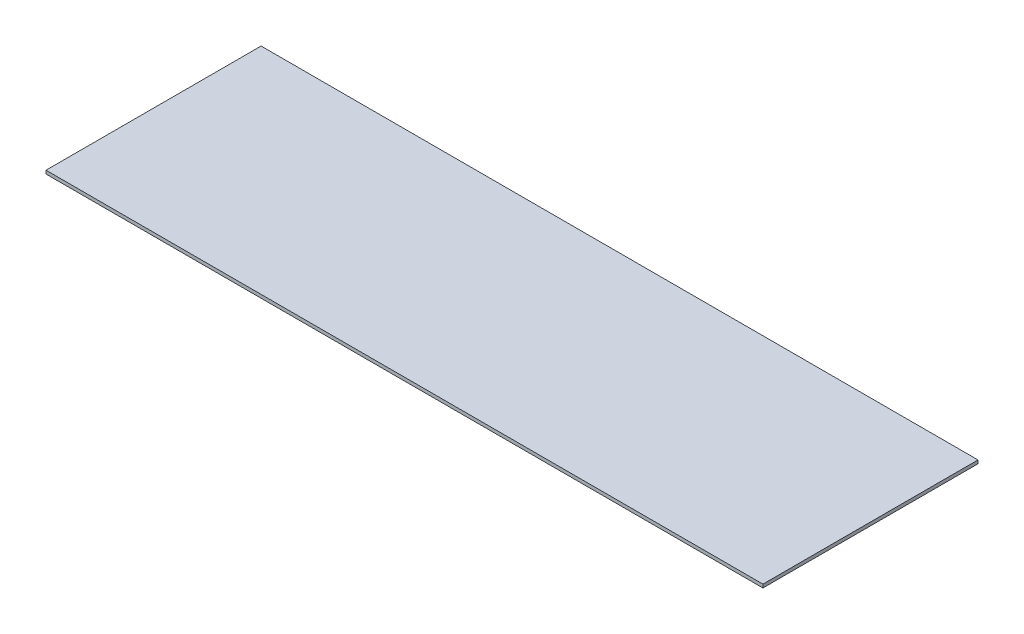
ISO-10303-21;
HEADER;
FILE_DESCRIPTION(('STEP AP214'),'2;1');
FILE_NAME('part.step','',(''),(''),'','','');
FILE_SCHEMA(('AUTOMOTIVE_DESIGN { 1 0 10303 214 1 1 1 1 }'));
ENDSEC;
DATA;
#1=APPLICATION_CONTEXT('core data for automotive mechanical design processes');
#2=APPLICATION_PROTOCOL_DEFINITION('international standard','automotive_design',2000,#1);
#3=PRODUCT_CONTEXT('',#1,'mechanical');
#4=PRODUCT('Part','Part','',(#3));
#5=PRODUCT_RELATED_PRODUCT_CATEGORY('part','',(#4));
#6=PRODUCT_DEFINITION_FORMATION('','',#4);
#7=PRODUCT_DEFINITION_CONTEXT('part definition',#1,'design');
#8=PRODUCT_DEFINITION('design','',#6,#7);
#9=PRODUCT_DEFINITION_SHAPE('','',#8);
#10=(LENGTH_UNIT() NAMED_UNIT(*) SI_UNIT(.MILLI.,.METRE.));
#11=(NAMED_UNIT(*) PLANE_ANGLE_UNIT() SI_UNIT($,.RADIAN.));
#12=(NAMED_UNIT(*) SI_UNIT($,.STERADIAN.) SOLID_ANGLE_UNIT());
#13=UNCERTAINTY_MEASURE_WITH_UNIT(LENGTH_MEASURE(1.E-05),#10,'distance_accuracy_value','');
#14=(GEOMETRIC_REPRESENTATION_CONTEXT(3) GLOBAL_UNCERTAINTY_ASSIGNED_CONTEXT((#13)) GLOBAL_UNIT_ASSIGNED_CONTEXT((#10,
#11,#12)) REPRESENTATION_CONTEXT('',''));
#15=CARTESIAN_POINT('',(0.,0.,0.));
#16=DIRECTION('',(0.,0.,1.));
#17=DIRECTION('',(1.,0.,0.));
#18=AXIS2_PLACEMENT_3D('',#15,#16,#17);
#19=CARTESIAN_POINT('',(0.,4.7625,0.));
#20=DIRECTION('',(1.,0.,0.));
#21=DIRECTION('',(0.,0.,-1.));
#22=AXIS2_PLACEMENT_3D('',#19,#20,#21);
#23=PLANE('',#22);
#24=DIRECTION('',(0.,0.,1.));
#25=VECTOR('',#24,1.);
#26=CARTESIAN_POINT('',(0.,0.,0.));
#27=LINE('',#26,#25);
#28=CARTESIAN_POINT('',(0.,0.,-304.8));
#29=VERTEX_POINT('',#28);
#30=CARTESIAN_POINT('',(0.,0.,0.));
#31=VERTEX_POINT('',#30);
#32=EDGE_CURVE('E97',#29,#31,#27,.T.);
#33=ORIENTED_EDGE('',*,*,#32,.T.);
#34=DIRECTION('',(0.,-1.,0.));
#35=VECTOR('',#34,1.);
#36=CARTESIAN_POINT('',(0.,4.7625,0.));
#37=LINE('',#36,#35);
#38=CARTESIAN_POINT('',(0.,4.7625,0.));
#39=VERTEX_POINT('',#38);
#40=EDGE_CURVE('E11',#39,#31,#37,.T.);
#41=ORIENTED_EDGE('',*,*,#40,.F.);
#42=DIRECTION('',(0.,0.,1.));
#43=VECTOR('',#42,1.);
#44=CARTESIAN_POINT('',(0.,4.7625,0.));
#45=LINE('',#44,#43);
#46=CARTESIAN_POINT('',(0.,4.7625,-304.8));
#47=VERTEX_POINT('',#46);
#48=EDGE_CURVE('E85',#47,#39,#45,.T.);
#49=ORIENTED_EDGE('',*,*,#48,.F.);
#50=DIRECTION('',(0.,-1.,0.));
#51=VECTOR('',#50,1.);
#52=CARTESIAN_POINT('',(0.,4.7625,-304.8));
#53=LINE('',#52,#51);
#54=EDGE_CURVE('E93',#47,#29,#53,.T.);
#55=ORIENTED_EDGE('',*,*,#54,.T.);
#56=EDGE_LOOP('',(#33,#41,#49,#55));
#57=FACE_BOUND('',#56,.T.);
#58=ADVANCED_FACE('F34',(#57),#23,.F.);
#59=CARTESIAN_POINT('',(0.,4.7625,0.));
#60=DIRECTION('',(0.,0.,-1.));
#61=DIRECTION('',(-1.,0.,0.));
#62=AXIS2_PLACEMENT_3D('',#59,#60,#61);
#63=PLANE('',#62);
#64=DIRECTION('',(1.,0.,0.));
#65=VECTOR('',#64,1.);
#66=CARTESIAN_POINT('',(0.,0.,0.));
#67=LINE('',#66,#65);
#68=CARTESIAN_POINT('',(1016.,0.,0.));
#69=VERTEX_POINT('',#68);
#70=EDGE_CURVE('E89',#31,#69,#67,.T.);
#71=ORIENTED_EDGE('',*,*,#70,.T.);
#72=DIRECTION('',(0.,-1.,0.));
#73=VECTOR('',#72,1.);
#74=CARTESIAN_POINT('',(1016.,4.7625,0.));
#75=LINE('',#74,#73);
#76=CARTESIAN_POINT('',(1016.,4.7625,0.));
#77=VERTEX_POINT('',#76);
#78=EDGE_CURVE('E42',#77,#69,#75,.T.);
#79=ORIENTED_EDGE('',*,*,#78,.F.);
#80=DIRECTION('',(1.,0.,0.));
#81=VECTOR('',#80,1.);
#82=CARTESIAN_POINT('',(0.,4.7625,0.));
#83=LINE('',#82,#81);
#84=EDGE_CURVE('E80',#39,#77,#83,.T.);
#85=ORIENTED_EDGE('',*,*,#84,.F.);
#86=ORIENTED_EDGE('',*,*,#40,.T.);
#87=EDGE_LOOP('',(#71,#79,#85,#86));
#88=FACE_BOUND('',#87,.T.);
#89=ADVANCED_FACE('F88',(#88),#63,.F.);
#90=CARTESIAN_POINT('',(1016.,4.7625,0.));
#91=DIRECTION('',(-1.,0.,0.));
#92=DIRECTION('',(0.,0.,1.));
#93=AXIS2_PLACEMENT_3D('',#90,#91,#92);
#94=PLANE('',#93);
#95=DIRECTION('',(0.,0.,-1.));
#96=VECTOR('',#95,1.);
#97=CARTESIAN_POINT('',(1016.,0.,0.));
#98=LINE('',#97,#96);
#99=CARTESIAN_POINT('',(1016.,0.,-304.8));
#100=VERTEX_POINT('',#99);
#101=EDGE_CURVE('E67',#69,#100,#98,.T.);
#102=ORIENTED_EDGE('',*,*,#101,.T.);
#103=DIRECTION('',(0.,-1.,0.));
#104=VECTOR('',#103,1.);
#105=CARTESIAN_POINT('',(1016.,4.7625,-304.8));
#106=LINE('',#105,#104);
#107=CARTESIAN_POINT('',(1016.,4.7625,-304.8));
#108=VERTEX_POINT('',#107);
#109=EDGE_CURVE('E90',#108,#100,#106,.T.);
#110=ORIENTED_EDGE('',*,*,#109,.F.);
#111=DIRECTION('',(0.,0.,-1.));
#112=VECTOR('',#111,1.);
#113=CARTESIAN_POINT('',(1016.,4.7625,0.));
#114=LINE('',#113,#112);
#115=EDGE_CURVE('E83',#77,#108,#114,.T.);
#116=ORIENTED_EDGE('',*,*,#115,.F.);
#117=ORIENTED_EDGE('',*,*,#78,.T.);
#118=EDGE_LOOP('',(#102,#110,#116,#117));
#119=FACE_BOUND('',#118,.T.);
#120=ADVANCED_FACE('F91',(#119),#94,.F.);
#121=CARTESIAN_POINT('',(0.,4.7625,-304.8));
#122=DIRECTION('',(0.,0.,1.));
#123=DIRECTION('',(1.,0.,0.));
#124=AXIS2_PLACEMENT_3D('',#121,#122,#123);
#125=PLANE('',#124);
#126=DIRECTION('',(-1.,0.,0.));
#127=VECTOR('',#126,1.);
#128=CARTESIAN_POINT('',(0.,0.,-304.8));
#129=LINE('',#128,#127);
#130=EDGE_CURVE('E73',#100,#29,#129,.T.);
#131=ORIENTED_EDGE('',*,*,#130,.T.);
#132=ORIENTED_EDGE('',*,*,#54,.F.);
#133=DIRECTION('',(-1.,0.,0.));
#134=VECTOR('',#133,1.);
#135=CARTESIAN_POINT('',(0.,4.7625,-304.8));
#136=LINE('',#135,#134);
#137=EDGE_CURVE('E50',#108,#47,#136,.T.);
#138=ORIENTED_EDGE('',*,*,#137,.F.);
#139=ORIENTED_EDGE('',*,*,#109,.T.);
#140=EDGE_LOOP('',(#131,#132,#138,#139));
#141=FACE_BOUND('',#140,.T.);
#142=ADVANCED_FACE('F104',(#141),#125,.F.);
#143=CARTESIAN_POINT('',(0.,4.7625,0.));
#144=DIRECTION('',(0.,-1.,0.));
#145=DIRECTION('',(0.,0.,-1.));
#146=AXIS2_PLACEMENT_3D('',#143,#144,#145);
#147=PLANE('',#146);
#148=ORIENTED_EDGE('',*,*,#48,.T.);
#149=ORIENTED_EDGE('',*,*,#84,.T.);
#150=ORIENTED_EDGE('',*,*,#115,.T.);
#151=ORIENTED_EDGE('',*,*,#137,.T.);
#152=EDGE_LOOP('',(#148,#149,#150,#151));
#153=FACE_BOUND('',#152,.T.);
#154=ADVANCED_FACE('F81',(#153),#147,.F.);
#155=CARTESIAN_POINT('',(0.,0.,0.));
#156=DIRECTION('',(0.,-1.,0.));
#157=DIRECTION('',(0.,0.,-1.));
#158=AXIS2_PLACEMENT_3D('',#155,#156,#157);
#159=PLANE('',#158);
#160=ORIENTED_EDGE('',*,*,#32,.F.);
#161=ORIENTED_EDGE('',*,*,#130,.F.);
#162=ORIENTED_EDGE('',*,*,#101,.F.);
#163=ORIENTED_EDGE('',*,*,#70,.F.);
#164=EDGE_LOOP('',(#160,#161,#162,#163));
#165=FACE_BOUND('',#164,.T.);
#166=ADVANCED_FACE('F107',(#165),#159,.T.);
#167=CLOSED_SHELL('',(#58,#89,#120,#142,#154,#166));
#168=MANIFOLD_SOLID_BREP('B2',#167);
#169=ADVANCED_BREP_SHAPE_REPRESENTATION('',(#18,#168),#14);
#170=SHAPE_DEFINITION_REPRESENTATION(#9,#169);
ENDSEC;
END-ISO-10303-21;
